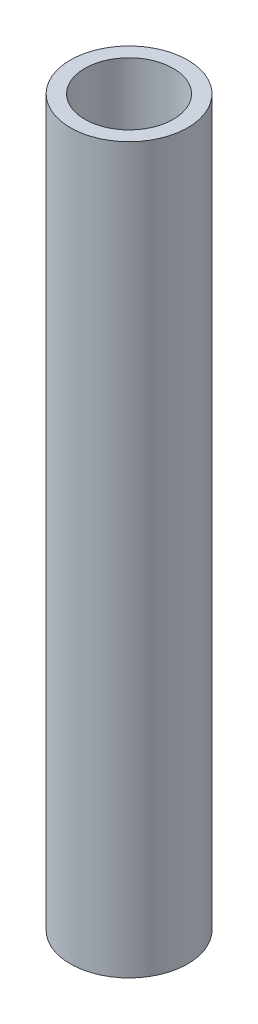
ISO-10303-21;
HEADER;
FILE_DESCRIPTION(('STEP AP214'),'2;1');
FILE_NAME('part.step','',(''),(''),'','','');
FILE_SCHEMA(('AUTOMOTIVE_DESIGN { 1 0 10303 214 1 1 1 1 }'));
ENDSEC;
DATA;
#1=APPLICATION_CONTEXT('core data for automotive mechanical design processes');
#2=APPLICATION_PROTOCOL_DEFINITION('international standard','automotive_design',2000,#1);
#3=PRODUCT_CONTEXT('',#1,'mechanical');
#4=PRODUCT('Part','Part','',(#3));
#5=PRODUCT_RELATED_PRODUCT_CATEGORY('part','',(#4));
#6=PRODUCT_DEFINITION_FORMATION('','',#4);
#7=PRODUCT_DEFINITION_CONTEXT('part definition',#1,'design');
#8=PRODUCT_DEFINITION('design','',#6,#7);
#9=PRODUCT_DEFINITION_SHAPE('','',#8);
#10=(LENGTH_UNIT() NAMED_UNIT(*) SI_UNIT(.MILLI.,.METRE.));
#11=(NAMED_UNIT(*) PLANE_ANGLE_UNIT() SI_UNIT($,.RADIAN.));
#12=(NAMED_UNIT(*) SI_UNIT($,.STERADIAN.) SOLID_ANGLE_UNIT());
#13=UNCERTAINTY_MEASURE_WITH_UNIT(LENGTH_MEASURE(1.E-05),#10,'distance_accuracy_value','');
#14=(GEOMETRIC_REPRESENTATION_CONTEXT(3) GLOBAL_UNCERTAINTY_ASSIGNED_CONTEXT((#13)) GLOBAL_UNIT_ASSIGNED_CONTEXT((#10,
#11,#12)) REPRESENTATION_CONTEXT('',''));
#15=CARTESIAN_POINT('',(0.,0.,0.));
#16=DIRECTION('',(0.,0.,1.));
#17=DIRECTION('',(1.,0.,0.));
#18=AXIS2_PLACEMENT_3D('',#15,#16,#17);
#19=CARTESIAN_POINT('',(0.,208.,0.));
#20=DIRECTION('',(0.,1.,0.));
#21=DIRECTION('',(0.,0.,1.));
#22=AXIS2_PLACEMENT_3D('',#19,#20,#21);
#23=PLANE('',#22);
#24=CARTESIAN_POINT('',(0.,208.,0.));
#25=DIRECTION('',(0.,1.,0.));
#26=DIRECTION('',(0.,0.,1.));
#27=AXIS2_PLACEMENT_3D('',#24,#25,#26);
#28=CIRCLE('',#27,16.85);
#29=CARTESIAN_POINT('',(0.,208.,-16.85));
#30=VERTEX_POINT('',#29);
#31=EDGE_CURVE('E10',#30,#30,#28,.T.);
#32=ORIENTED_EDGE('',*,*,#31,.T.);
#33=EDGE_LOOP('',(#32));
#34=FACE_BOUND('',#33,.T.);
#35=CARTESIAN_POINT('',(0.,208.,0.));
#36=DIRECTION('',(0.,1.,0.));
#37=DIRECTION('',(0.,0.,1.));
#38=AXIS2_PLACEMENT_3D('',#35,#36,#37);
#39=CIRCLE('',#38,12.7);
#40=CARTESIAN_POINT('',(0.,208.,-12.7));
#41=VERTEX_POINT('',#40);
#42=EDGE_CURVE('E50',#41,#41,#39,.T.);
#43=ORIENTED_EDGE('',*,*,#42,.F.);
#44=EDGE_LOOP('',(#43));
#45=FACE_BOUND('',#44,.T.);
#46=ADVANCED_FACE('F37',(#34,#45),#23,.T.);
#47=CARTESIAN_POINT('',(0.,0.,0.));
#48=DIRECTION('',(0.,1.,0.));
#49=DIRECTION('',(0.,0.,1.));
#50=AXIS2_PLACEMENT_3D('',#47,#48,#49);
#51=PLANE('',#50);
#52=CARTESIAN_POINT('',(0.,0.,0.));
#53=DIRECTION('',(0.,1.,0.));
#54=DIRECTION('',(0.,0.,1.));
#55=AXIS2_PLACEMENT_3D('',#52,#53,#54);
#56=CIRCLE('',#55,16.85);
#57=CARTESIAN_POINT('',(0.,0.,-16.85));
#58=VERTEX_POINT('',#57);
#59=EDGE_CURVE('E41',#58,#58,#56,.T.);
#60=ORIENTED_EDGE('',*,*,#59,.F.);
#61=EDGE_LOOP('',(#60));
#62=FACE_BOUND('',#61,.T.);
#63=CARTESIAN_POINT('',(0.,0.,0.));
#64=DIRECTION('',(0.,1.,0.));
#65=DIRECTION('',(0.,0.,1.));
#66=AXIS2_PLACEMENT_3D('',#63,#64,#65);
#67=CIRCLE('',#66,12.7);
#68=CARTESIAN_POINT('',(0.,0.,-12.7));
#69=VERTEX_POINT('',#68);
#70=EDGE_CURVE('E52',#69,#69,#67,.T.);
#71=ORIENTED_EDGE('',*,*,#70,.T.);
#72=EDGE_LOOP('',(#71));
#73=FACE_BOUND('',#72,.T.);
#74=ADVANCED_FACE('F64',(#62,#73),#51,.F.);
#75=CARTESIAN_POINT('',(0.,208.,0.));
#76=DIRECTION('',(0.,-1.,0.));
#77=DIRECTION('',(0.,0.,-1.));
#78=AXIS2_PLACEMENT_3D('',#75,#76,#77);
#79=CYLINDRICAL_SURFACE('',#78,16.85);
#80=CARTESIAN_POINT('',(0.,208.,-16.85));
#81=CARTESIAN_POINT('',(0.,205.833333333333,-16.85));
#82=CARTESIAN_POINT('',(0.,203.666666666667,-16.85));
#83=CARTESIAN_POINT('',(0.,199.333333333333,-16.85));
#84=CARTESIAN_POINT('',(0.,197.166666666667,-16.85));
#85=CARTESIAN_POINT('',(0.,192.833333333333,-16.85));
#86=CARTESIAN_POINT('',(0.,190.666666666667,-16.85));
#87=CARTESIAN_POINT('',(0.,186.333333333333,-16.85));
#88=CARTESIAN_POINT('',(0.,184.166666666667,-16.85));
#89=CARTESIAN_POINT('',(0.,179.833333333333,-16.85));
#90=CARTESIAN_POINT('',(0.,177.666666666667,-16.85));
#91=CARTESIAN_POINT('',(0.,173.333333333333,-16.85));
#92=CARTESIAN_POINT('',(0.,171.166666666667,-16.85));
#93=CARTESIAN_POINT('',(0.,166.833333333333,-16.85));
#94=CARTESIAN_POINT('',(0.,164.666666666667,-16.85));
#95=CARTESIAN_POINT('',(0.,160.333333333333,-16.85));
#96=CARTESIAN_POINT('',(0.,158.166666666667,-16.85));
#97=CARTESIAN_POINT('',(0.,153.833333333333,-16.85));
#98=CARTESIAN_POINT('',(0.,151.666666666667,-16.85));
#99=CARTESIAN_POINT('',(0.,147.333333333333,-16.85));
#100=CARTESIAN_POINT('',(0.,145.166666666667,-16.85));
#101=CARTESIAN_POINT('',(0.,140.833333333333,-16.85));
#102=CARTESIAN_POINT('',(0.,138.666666666667,-16.85));
#103=CARTESIAN_POINT('',(0.,134.333333333333,-16.85));
#104=CARTESIAN_POINT('',(0.,132.166666666667,-16.85));
#105=CARTESIAN_POINT('',(0.,127.833333333333,-16.85));
#106=CARTESIAN_POINT('',(0.,125.666666666667,-16.85));
#107=CARTESIAN_POINT('',(0.,121.333333333333,-16.85));
#108=CARTESIAN_POINT('',(0.,119.166666666667,-16.85));
#109=CARTESIAN_POINT('',(0.,114.833333333333,-16.85));
#110=CARTESIAN_POINT('',(0.,112.666666666667,-16.85));
#111=CARTESIAN_POINT('',(0.,108.333333333333,-16.85));
#112=CARTESIAN_POINT('',(0.,106.166666666667,-16.85));
#113=CARTESIAN_POINT('',(0.,101.833333333333,-16.85));
#114=CARTESIAN_POINT('',(0.,99.6666666666666,-16.85));
#115=CARTESIAN_POINT('',(0.,95.3333333333333,-16.85));
#116=CARTESIAN_POINT('',(0.,93.1666666666666,-16.85));
#117=CARTESIAN_POINT('',(0.,88.8333333333333,-16.85));
#118=CARTESIAN_POINT('',(0.,86.6666666666666,-16.85));
#119=CARTESIAN_POINT('',(0.,82.3333333333333,-16.85));
#120=CARTESIAN_POINT('',(0.,80.1666666666667,-16.85));
#121=CARTESIAN_POINT('',(0.,75.8333333333333,-16.85));
#122=CARTESIAN_POINT('',(0.,73.6666666666667,-16.85));
#123=CARTESIAN_POINT('',(0.,69.3333333333333,-16.85));
#124=CARTESIAN_POINT('',(0.,67.1666666666667,-16.85));
#125=CARTESIAN_POINT('',(0.,62.8333333333333,-16.85));
#126=CARTESIAN_POINT('',(0.,60.6666666666667,-16.85));
#127=CARTESIAN_POINT('',(0.,56.3333333333333,-16.85));
#128=CARTESIAN_POINT('',(0.,54.1666666666667,-16.85));
#129=CARTESIAN_POINT('',(0.,49.8333333333333,-16.85));
#130=CARTESIAN_POINT('',(0.,47.6666666666667,-16.85));
#131=CARTESIAN_POINT('',(0.,43.3333333333333,-16.85));
#132=CARTESIAN_POINT('',(0.,41.1666666666667,-16.85));
#133=CARTESIAN_POINT('',(0.,36.8333333333333,-16.85));
#134=CARTESIAN_POINT('',(0.,34.6666666666667,-16.85));
#135=CARTESIAN_POINT('',(0.,30.3333333333333,-16.85));
#136=CARTESIAN_POINT('',(0.,28.1666666666667,-16.85));
#137=CARTESIAN_POINT('',(0.,23.8333333333333,-16.85));
#138=CARTESIAN_POINT('',(0.,21.6666666666667,-16.85));
#139=CARTESIAN_POINT('',(0.,17.3333333333333,-16.85));
#140=CARTESIAN_POINT('',(0.,15.1666666666667,-16.85));
#141=CARTESIAN_POINT('',(0.,10.8333333333333,-16.85));
#142=CARTESIAN_POINT('',(0.,8.66666666666667,-16.85));
#143=CARTESIAN_POINT('',(0.,4.33333333333334,-16.85));
#144=CARTESIAN_POINT('',(0.,2.16666666666667,-16.85));
#145=CARTESIAN_POINT('',(0.,0.,-16.85));
#146=B_SPLINE_CURVE_WITH_KNOTS('',3,(#80,#81,#82,#83,#84,#85,#86,#87,#88,#89,#90,#91,#92,#93,
#94,#95,#96,#97,#98,#99,#100,#101,#102,#103,#104,#105,#106,#107,#108,#109,#110,#111,#112,#113,
#114,#115,#116,#117,#118,#119,#120,#121,#122,#123,#124,#125,#126,#127,#128,#129,#130,#131,#132,
#133,#134,#135,#136,#137,#138,#139,#140,#141,#142,#143,#144,#145),.UNSPECIFIED.,.F.,.F.,(4,2,2,
2,2,2,2,2,2,2,2,2,2,2,2,2,2,2,2,2,2,2,2,2,2,2,2,2,2,2,2,2,4),(0.,6.50000000000001,13.,19.5,26.,
32.5,39.,45.5,52.,58.5,65.,71.5,78.,84.5,91.,97.5,104.,110.5,117.,123.5,130.,136.5,143.,149.5,
156.,162.5,169.,175.5,182.,188.5,195.,201.5,208.),.UNSPECIFIED.);
#147=EDGE_CURVE('BSEAM39',#30,#58,#146,.T.);
#148=ORIENTED_EDGE('',*,*,#31,.F.);
#149=ORIENTED_EDGE('',*,*,#59,.T.);
#150=ORIENTED_EDGE('',*,*,#147,.T.);
#151=ORIENTED_EDGE('',*,*,#147,.F.);
#152=EDGE_LOOP('',(#148,#150,#149,#151));
#153=FACE_BOUND('',#152,.T.);
#154=ADVANCED_FACE('F39',(#153),#79,.T.);
#155=CARTESIAN_POINT('',(0.,208.,0.));
#156=DIRECTION('',(0.,-1.,0.));
#157=DIRECTION('',(0.,0.,-1.));
#158=AXIS2_PLACEMENT_3D('',#155,#156,#157);
#159=CYLINDRICAL_SURFACE('',#158,12.7);
#160=CARTESIAN_POINT('',(0.,208.,-12.7));
#161=CARTESIAN_POINT('',(0.,205.833333333333,-12.7));
#162=CARTESIAN_POINT('',(0.,203.666666666667,-12.7));
#163=CARTESIAN_POINT('',(0.,199.333333333333,-12.7));
#164=CARTESIAN_POINT('',(0.,197.166666666667,-12.7));
#165=CARTESIAN_POINT('',(0.,192.833333333333,-12.7));
#166=CARTESIAN_POINT('',(0.,190.666666666667,-12.7));
#167=CARTESIAN_POINT('',(0.,186.333333333333,-12.7));
#168=CARTESIAN_POINT('',(0.,184.166666666667,-12.7));
#169=CARTESIAN_POINT('',(0.,179.833333333333,-12.7));
#170=CARTESIAN_POINT('',(0.,177.666666666667,-12.7));
#171=CARTESIAN_POINT('',(0.,173.333333333333,-12.7));
#172=CARTESIAN_POINT('',(0.,171.166666666667,-12.7));
#173=CARTESIAN_POINT('',(0.,166.833333333333,-12.7));
#174=CARTESIAN_POINT('',(0.,164.666666666667,-12.7));
#175=CARTESIAN_POINT('',(0.,160.333333333333,-12.7));
#176=CARTESIAN_POINT('',(0.,158.166666666667,-12.7));
#177=CARTESIAN_POINT('',(0.,153.833333333333,-12.7));
#178=CARTESIAN_POINT('',(0.,151.666666666667,-12.7));
#179=CARTESIAN_POINT('',(0.,147.333333333333,-12.7));
#180=CARTESIAN_POINT('',(0.,145.166666666667,-12.7));
#181=CARTESIAN_POINT('',(0.,140.833333333333,-12.7));
#182=CARTESIAN_POINT('',(0.,138.666666666667,-12.7));
#183=CARTESIAN_POINT('',(0.,134.333333333333,-12.7));
#184=CARTESIAN_POINT('',(0.,132.166666666667,-12.7));
#185=CARTESIAN_POINT('',(0.,127.833333333333,-12.7));
#186=CARTESIAN_POINT('',(0.,125.666666666667,-12.7));
#187=CARTESIAN_POINT('',(0.,121.333333333333,-12.7));
#188=CARTESIAN_POINT('',(0.,119.166666666667,-12.7));
#189=CARTESIAN_POINT('',(0.,114.833333333333,-12.7));
#190=CARTESIAN_POINT('',(0.,112.666666666667,-12.7));
#191=CARTESIAN_POINT('',(0.,108.333333333333,-12.7));
#192=CARTESIAN_POINT('',(0.,106.166666666667,-12.7));
#193=CARTESIAN_POINT('',(0.,101.833333333333,-12.7));
#194=CARTESIAN_POINT('',(0.,99.6666666666667,-12.7));
#195=CARTESIAN_POINT('',(0.,95.3333333333333,-12.7));
#196=CARTESIAN_POINT('',(0.,93.1666666666667,-12.7));
#197=CARTESIAN_POINT('',(0.,88.8333333333333,-12.7));
#198=CARTESIAN_POINT('',(0.,86.6666666666667,-12.7));
#199=CARTESIAN_POINT('',(0.,82.3333333333333,-12.7));
#200=CARTESIAN_POINT('',(0.,80.1666666666666,-12.7));
#201=CARTESIAN_POINT('',(0.,75.8333333333333,-12.7));
#202=CARTESIAN_POINT('',(0.,73.6666666666667,-12.7));
#203=CARTESIAN_POINT('',(0.,69.3333333333333,-12.7));
#204=CARTESIAN_POINT('',(0.,67.1666666666667,-12.7));
#205=CARTESIAN_POINT('',(0.,62.8333333333333,-12.7));
#206=CARTESIAN_POINT('',(0.,60.6666666666667,-12.7));
#207=CARTESIAN_POINT('',(0.,56.3333333333333,-12.7));
#208=CARTESIAN_POINT('',(0.,54.1666666666667,-12.7));
#209=CARTESIAN_POINT('',(0.,49.8333333333333,-12.7));
#210=CARTESIAN_POINT('',(0.,47.6666666666667,-12.7));
#211=CARTESIAN_POINT('',(0.,43.3333333333333,-12.7));
#212=CARTESIAN_POINT('',(0.,41.1666666666667,-12.7));
#213=CARTESIAN_POINT('',(0.,36.8333333333333,-12.7));
#214=CARTESIAN_POINT('',(0.,34.6666666666667,-12.7));
#215=CARTESIAN_POINT('',(0.,30.3333333333333,-12.7));
#216=CARTESIAN_POINT('',(0.,28.1666666666667,-12.7));
#217=CARTESIAN_POINT('',(0.,23.8333333333333,-12.7));
#218=CARTESIAN_POINT('',(0.,21.6666666666667,-12.7));
#219=CARTESIAN_POINT('',(0.,17.3333333333333,-12.7));
#220=CARTESIAN_POINT('',(0.,15.1666666666667,-12.7));
#221=CARTESIAN_POINT('',(0.,10.8333333333333,-12.7));
#222=CARTESIAN_POINT('',(0.,8.66666666666667,-12.7));
#223=CARTESIAN_POINT('',(0.,4.33333333333334,-12.7));
#224=CARTESIAN_POINT('',(0.,2.16666666666667,-12.7));
#225=CARTESIAN_POINT('',(0.,0.,-12.7));
#226=B_SPLINE_CURVE_WITH_KNOTS('',3,(#160,#161,#162,#163,#164,#165,#166,#167,#168,#169,#170,
#171,#172,#173,#174,#175,#176,#177,#178,#179,#180,#181,#182,#183,#184,#185,#186,#187,#188,#189,
#190,#191,#192,#193,#194,#195,#196,#197,#198,#199,#200,#201,#202,#203,#204,#205,#206,#207,#208,
#209,#210,#211,#212,#213,#214,#215,#216,#217,#218,#219,#220,#221,#222,#223,#224,#225),
.UNSPECIFIED.,.F.,.F.,(4,2,2,2,2,2,2,2,2,2,2,2,2,2,2,2,2,2,2,2,2,2,2,2,2,2,2,2,2,2,2,2,4),(0.,
6.49999999999998,13.,19.5,26.,32.5,39.,45.5,52.,58.5,65.,71.5,78.,84.5,91.,97.5,104.,110.5,117.,
123.5,130.,136.5,143.,149.5,156.,162.5,169.,175.5,182.,188.5,195.,201.5,208.),.UNSPECIFIED.);
#227=EDGE_CURVE('BSEAM60',#41,#69,#226,.T.);
#228=ORIENTED_EDGE('',*,*,#42,.T.);
#229=ORIENTED_EDGE('',*,*,#70,.F.);
#230=ORIENTED_EDGE('',*,*,#227,.T.);
#231=ORIENTED_EDGE('',*,*,#227,.F.);
#232=EDGE_LOOP('',(#228,#230,#229,#231));
#233=FACE_BOUND('',#232,.T.);
#234=ADVANCED_FACE('F60',(#233),#159,.F.);
#235=CLOSED_SHELL('',(#46,#74,#154,#234));
#236=MANIFOLD_SOLID_BREP('B2',#235);
#237=ADVANCED_BREP_SHAPE_REPRESENTATION('',(#18,#236),#14);
#238=SHAPE_DEFINITION_REPRESENTATION(#9,#237);
ENDSEC;
END-ISO-10303-21;
